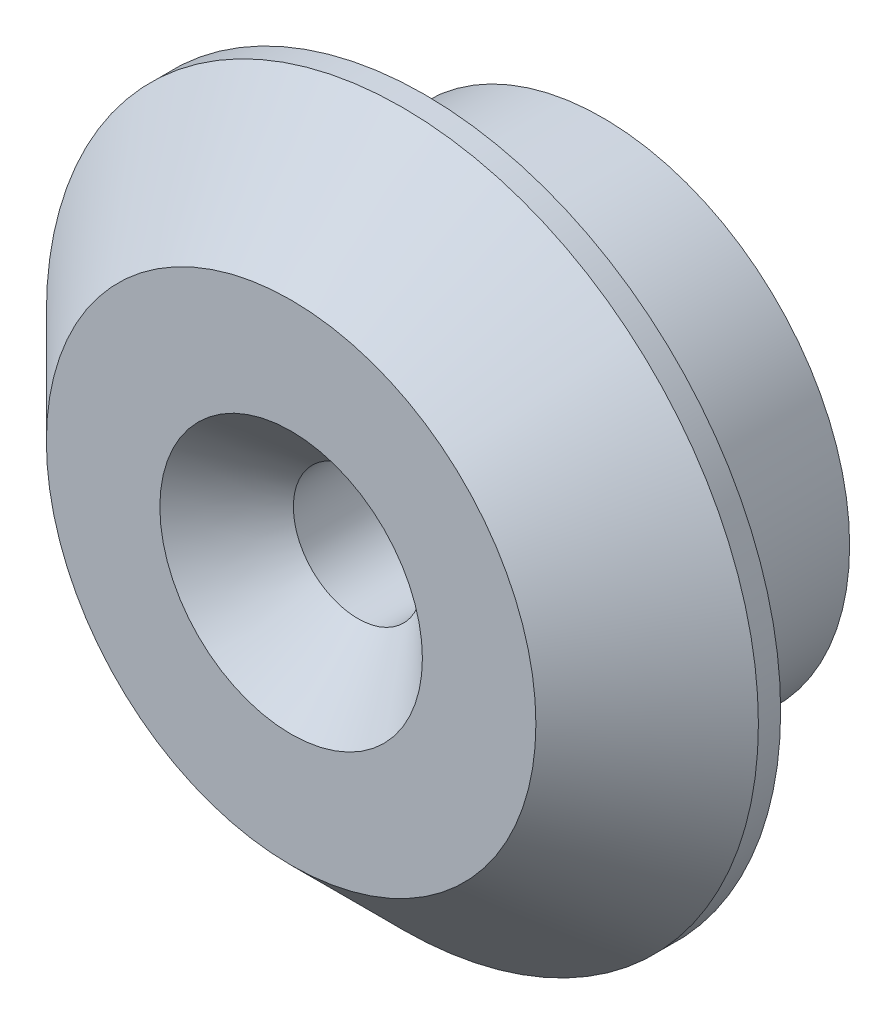
ISO-10303-21;
HEADER;
FILE_DESCRIPTION(('STEP AP214'),'2;1');
FILE_NAME('part.step','',(''),(''),'','','');
FILE_SCHEMA(('AUTOMOTIVE_DESIGN { 1 0 10303 214 1 1 1 1 }'));
ENDSEC;
DATA;
#1=APPLICATION_CONTEXT('core data for automotive mechanical design processes');
#2=APPLICATION_PROTOCOL_DEFINITION('international standard','automotive_design',2000,#1);
#3=PRODUCT_CONTEXT('',#1,'mechanical');
#4=PRODUCT('Part','Part','',(#3));
#5=PRODUCT_RELATED_PRODUCT_CATEGORY('part','',(#4));
#6=PRODUCT_DEFINITION_FORMATION('','',#4);
#7=PRODUCT_DEFINITION_CONTEXT('part definition',#1,'design');
#8=PRODUCT_DEFINITION('design','',#6,#7);
#9=PRODUCT_DEFINITION_SHAPE('','',#8);
#10=(LENGTH_UNIT() NAMED_UNIT(*) SI_UNIT(.MILLI.,.METRE.));
#11=(NAMED_UNIT(*) PLANE_ANGLE_UNIT() SI_UNIT($,.RADIAN.));
#12=(NAMED_UNIT(*) SI_UNIT($,.STERADIAN.) SOLID_ANGLE_UNIT());
#13=UNCERTAINTY_MEASURE_WITH_UNIT(LENGTH_MEASURE(1.E-05),#10,'distance_accuracy_value','');
#14=(GEOMETRIC_REPRESENTATION_CONTEXT(3) GLOBAL_UNCERTAINTY_ASSIGNED_CONTEXT((#13)) GLOBAL_UNIT_ASSIGNED_CONTEXT((#10,
#11,#12)) REPRESENTATION_CONTEXT('',''));
#15=CARTESIAN_POINT('',(0.,0.,0.));
#16=DIRECTION('',(0.,0.,1.));
#17=DIRECTION('',(1.,0.,0.));
#18=AXIS2_PLACEMENT_3D('',#15,#16,#17);
#19=CARTESIAN_POINT('',(0.,0.,7.));
#20=DIRECTION('',(0.,0.,-1.));
#21=DIRECTION('',(-1.,0.,0.));
#22=AXIS2_PLACEMENT_3D('',#19,#20,#21);
#23=CYLINDRICAL_SURFACE('',#22,5.55);
#24=CARTESIAN_POINT('',(0.,0.,0.));
#25=DIRECTION('',(0.,0.,1.));
#26=DIRECTION('',(1.,0.,0.));
#27=AXIS2_PLACEMENT_3D('',#24,#25,#26);
#28=CIRCLE('',#27,5.55);
#29=CARTESIAN_POINT('',(5.55,0.,0.));
#30=VERTEX_POINT('',#29);
#31=EDGE_CURVE('E63',#30,#30,#28,.T.);
#32=ORIENTED_EDGE('',*,*,#31,.T.);
#33=EDGE_LOOP('',(#32));
#34=FACE_BOUND('',#33,.T.);
#35=CARTESIAN_POINT('',(0.,0.,4.));
#36=DIRECTION('',(0.,0.,1.));
#37=DIRECTION('',(1.,0.,0.));
#38=AXIS2_PLACEMENT_3D('',#35,#36,#37);
#39=CIRCLE('',#38,5.55);
#40=CARTESIAN_POINT('',(5.55,0.,4.));
#41=VERTEX_POINT('',#40);
#42=EDGE_CURVE('E48',#41,#41,#39,.T.);
#43=ORIENTED_EDGE('',*,*,#42,.F.);
#44=EDGE_LOOP('',(#43));
#45=FACE_BOUND('',#44,.T.);
#46=ADVANCED_FACE('F34',(#34,#45),#23,.T.);
#47=CARTESIAN_POINT('',(0.,0.,7.));
#48=DIRECTION('',(0.,0.,1.));
#49=DIRECTION('',(1.,0.,0.));
#50=AXIS2_PLACEMENT_3D('',#47,#48,#49);
#51=PLANE('',#50);
#52=CARTESIAN_POINT('',(0.,0.,7.));
#53=DIRECTION('',(0.,0.,1.));
#54=DIRECTION('',(1.,0.,0.));
#55=AXIS2_PLACEMENT_3D('',#52,#53,#54);
#56=CIRCLE('',#55,5.50000000000001);
#57=CARTESIAN_POINT('',(5.50000000000001,0.,7.));
#58=VERTEX_POINT('',#57);
#59=EDGE_CURVE('E42',#58,#58,#56,.T.);
#60=ORIENTED_EDGE('',*,*,#59,.T.);
#61=EDGE_LOOP('',(#60));
#62=FACE_BOUND('',#61,.T.);
#63=CARTESIAN_POINT('',(0.,0.,7.));
#64=DIRECTION('',(0.,0.,1.));
#65=DIRECTION('',(1.,0.,0.));
#66=AXIS2_PLACEMENT_3D('',#63,#64,#65);
#67=CIRCLE('',#66,2.95);
#68=CARTESIAN_POINT('',(2.95,0.,7.));
#69=VERTEX_POINT('',#68);
#70=EDGE_CURVE('E54',#69,#69,#67,.F.);
#71=ORIENTED_EDGE('',*,*,#70,.T.);
#72=EDGE_LOOP('',(#71));
#73=FACE_BOUND('',#72,.T.);
#74=ADVANCED_FACE('F85',(#62,#73),#51,.T.);
#75=CARTESIAN_POINT('',(0.,0.,0.));
#76=DIRECTION('',(0.,0.,1.));
#77=DIRECTION('',(1.,0.,0.));
#78=AXIS2_PLACEMENT_3D('',#75,#76,#77);
#79=PLANE('',#78);
#80=ORIENTED_EDGE('',*,*,#31,.F.);
#81=EDGE_LOOP('',(#80));
#82=FACE_BOUND('',#81,.T.);
#83=CARTESIAN_POINT('',(0.,0.,0.));
#84=DIRECTION('',(0.,0.,1.));
#85=DIRECTION('',(1.,0.,0.));
#86=AXIS2_PLACEMENT_3D('',#83,#84,#85);
#87=CIRCLE('',#86,1.45);
#88=CARTESIAN_POINT('',(1.45,0.,0.));
#89=VERTEX_POINT('',#88);
#90=EDGE_CURVE('E67',#89,#89,#87,.T.);
#91=ORIENTED_EDGE('',*,*,#90,.T.);
#92=EDGE_LOOP('',(#91));
#93=FACE_BOUND('',#92,.T.);
#94=ADVANCED_FACE('F91',(#82,#93),#79,.F.);
#95=CARTESIAN_POINT('',(0.,0.,7.));
#96=DIRECTION('',(0.,0.,-1.));
#97=DIRECTION('',(-1.,0.,0.));
#98=AXIS2_PLACEMENT_3D('',#95,#96,#97);
#99=CYLINDRICAL_SURFACE('',#98,1.45);
#100=CARTESIAN_POINT('',(0.,0.,5.5));
#101=DIRECTION('',(0.,0.,1.));
#102=DIRECTION('',(1.,0.,0.));
#103=AXIS2_PLACEMENT_3D('',#100,#101,#102);
#104=CIRCLE('',#103,1.45);
#105=CARTESIAN_POINT('',(1.45,0.,5.5));
#106=VERTEX_POINT('',#105);
#107=EDGE_CURVE('E59',#106,#106,#104,.T.);
#108=ORIENTED_EDGE('',*,*,#107,.T.);
#109=EDGE_LOOP('',(#108));
#110=FACE_BOUND('',#109,.T.);
#111=ORIENTED_EDGE('',*,*,#90,.F.);
#112=EDGE_LOOP('',(#111));
#113=FACE_BOUND('',#112,.T.);
#114=ADVANCED_FACE('F95',(#110,#113),#99,.F.);
#115=CARTESIAN_POINT('',(0.,0.,5.5));
#116=DIRECTION('',(0.,0.,1.));
#117=DIRECTION('',(1.,0.,0.));
#118=AXIS2_PLACEMENT_3D('',#115,#116,#117);
#119=CONICAL_SURFACE('',#118,1.45,0.785398163397449);
#120=CARTESIAN_POINT('',(2.95,0.,7.));
#121=CARTESIAN_POINT('',(2.934375,0.,6.984375));
#122=CARTESIAN_POINT('',(2.91875,0.,6.96875));
#123=CARTESIAN_POINT('',(2.8875,0.,6.9375));
#124=CARTESIAN_POINT('',(2.871875,0.,6.921875));
#125=CARTESIAN_POINT('',(2.840625,0.,6.890625));
#126=CARTESIAN_POINT('',(2.825,0.,6.875));
#127=CARTESIAN_POINT('',(2.79375,0.,6.84375));
#128=CARTESIAN_POINT('',(2.778125,0.,6.828125));
#129=CARTESIAN_POINT('',(2.746875,0.,6.796875));
#130=CARTESIAN_POINT('',(2.73125,0.,6.78125));
#131=CARTESIAN_POINT('',(2.7,0.,6.75));
#132=CARTESIAN_POINT('',(2.684375,0.,6.734375));
#133=CARTESIAN_POINT('',(2.653125,0.,6.703125));
#134=CARTESIAN_POINT('',(2.6375,0.,6.6875));
#135=CARTESIAN_POINT('',(2.60625,0.,6.65625));
#136=CARTESIAN_POINT('',(2.590625,0.,6.640625));
#137=CARTESIAN_POINT('',(2.559375,0.,6.609375));
#138=CARTESIAN_POINT('',(2.54375,0.,6.59375));
#139=CARTESIAN_POINT('',(2.5125,0.,6.5625));
#140=CARTESIAN_POINT('',(2.496875,0.,6.546875));
#141=CARTESIAN_POINT('',(2.465625,0.,6.515625));
#142=CARTESIAN_POINT('',(2.45,0.,6.5));
#143=CARTESIAN_POINT('',(2.41875,0.,6.46875));
#144=CARTESIAN_POINT('',(2.403125,0.,6.453125));
#145=CARTESIAN_POINT('',(2.371875,0.,6.421875));
#146=CARTESIAN_POINT('',(2.35625,0.,6.40625));
#147=CARTESIAN_POINT('',(2.325,0.,6.375));
#148=CARTESIAN_POINT('',(2.309375,0.,6.359375));
#149=CARTESIAN_POINT('',(2.278125,0.,6.328125));
#150=CARTESIAN_POINT('',(2.2625,0.,6.3125));
#151=CARTESIAN_POINT('',(2.23125,0.,6.28125));
#152=CARTESIAN_POINT('',(2.215625,0.,6.265625));
#153=CARTESIAN_POINT('',(2.184375,0.,6.234375));
#154=CARTESIAN_POINT('',(2.16875,0.,6.21875));
#155=CARTESIAN_POINT('',(2.1375,0.,6.1875));
#156=CARTESIAN_POINT('',(2.121875,0.,6.171875));
#157=CARTESIAN_POINT('',(2.090625,0.,6.140625));
#158=CARTESIAN_POINT('',(2.075,0.,6.125));
#159=CARTESIAN_POINT('',(2.04375,0.,6.09375));
#160=CARTESIAN_POINT('',(2.028125,0.,6.078125));
#161=CARTESIAN_POINT('',(1.996875,0.,6.046875));
#162=CARTESIAN_POINT('',(1.98125,0.,6.03125));
#163=CARTESIAN_POINT('',(1.95,0.,6.));
#164=CARTESIAN_POINT('',(1.934375,0.,5.984375));
#165=CARTESIAN_POINT('',(1.903125,0.,5.953125));
#166=CARTESIAN_POINT('',(1.8875,0.,5.9375));
#167=CARTESIAN_POINT('',(1.85625,0.,5.90625));
#168=CARTESIAN_POINT('',(1.840625,0.,5.890625));
#169=CARTESIAN_POINT('',(1.809375,0.,5.859375));
#170=CARTESIAN_POINT('',(1.79375,0.,5.84375));
#171=CARTESIAN_POINT('',(1.7625,0.,5.8125));
#172=CARTESIAN_POINT('',(1.746875,0.,5.796875));
#173=CARTESIAN_POINT('',(1.715625,0.,5.765625));
#174=CARTESIAN_POINT('',(1.7,0.,5.75));
#175=CARTESIAN_POINT('',(1.66875,0.,5.71875));
#176=CARTESIAN_POINT('',(1.653125,0.,5.703125));
#177=CARTESIAN_POINT('',(1.621875,0.,5.671875));
#178=CARTESIAN_POINT('',(1.60625,0.,5.65625));
#179=CARTESIAN_POINT('',(1.575,0.,5.625));
#180=CARTESIAN_POINT('',(1.559375,0.,5.609375));
#181=CARTESIAN_POINT('',(1.528125,0.,5.578125));
#182=CARTESIAN_POINT('',(1.5125,0.,5.5625));
#183=CARTESIAN_POINT('',(1.48125,0.,5.53125));
#184=CARTESIAN_POINT('',(1.465625,0.,5.515625));
#185=CARTESIAN_POINT('',(1.45,0.,5.5));
#186=B_SPLINE_CURVE_WITH_KNOTS('',3,(#120,#121,#122,#123,#124,#125,#126,#127,#128,#129,#130,
#131,#132,#133,#134,#135,#136,#137,#138,#139,#140,#141,#142,#143,#144,#145,#146,#147,#148,#149,
#150,#151,#152,#153,#154,#155,#156,#157,#158,#159,#160,#161,#162,#163,#164,#165,#166,#167,#168,
#169,#170,#171,#172,#173,#174,#175,#176,#177,#178,#179,#180,#181,#182,#183,#184,#185),
.UNSPECIFIED.,.F.,.F.,(4,2,2,2,2,2,2,2,2,2,2,2,2,2,2,2,2,2,2,2,2,2,2,2,2,2,2,2,2,2,2,2,4),(0.,
0.0662912607362389,0.132582521472478,0.198873782208717,0.265165042944955,0.331456303681194,
0.397747564417433,0.464038825153672,0.53033008588991,0.59662134662615,0.662912607362388,
0.729203868098626,0.795495128834865,0.861786389571104,0.928077650307343,0.994368911043581,
1.06066017177982,1.12695143251606,1.1932426932523,1.25953395398854,1.32582521472478,
1.39211647546101,1.45840773619725,1.52469899693349,1.59099025766973,1.65728151840597,
1.72357277914221,1.78986403987845,1.85615530061468,1.92244656135092,1.98873782208716,
2.0550290828234,2.12132034355964),.UNSPECIFIED.);
#187=EDGE_CURVE('BSEAM80',#69,#106,#186,.T.);
#188=ORIENTED_EDGE('',*,*,#70,.F.);
#189=ORIENTED_EDGE('',*,*,#107,.F.);
#190=ORIENTED_EDGE('',*,*,#187,.T.);
#191=ORIENTED_EDGE('',*,*,#187,.F.);
#192=EDGE_LOOP('',(#188,#190,#189,#191));
#193=FACE_BOUND('',#192,.T.);
#194=ADVANCED_FACE('F80',(#193),#119,.F.);
#195=CARTESIAN_POINT('',(0.,0.,4.));
#196=DIRECTION('',(0.,0.,1.));
#197=DIRECTION('',(1.,0.,0.));
#198=AXIS2_PLACEMENT_3D('',#195,#196,#197);
#199=PLANE('',#198);
#200=CARTESIAN_POINT('',(0.,0.,4.));
#201=DIRECTION('',(0.,0.,1.));
#202=DIRECTION('',(1.,0.,0.));
#203=AXIS2_PLACEMENT_3D('',#200,#201,#202);
#204=CIRCLE('',#203,8.);
#205=CARTESIAN_POINT('',(8.,0.,4.));
#206=VERTEX_POINT('',#205);
#207=EDGE_CURVE('E71',#206,#206,#204,.T.);
#208=ORIENTED_EDGE('',*,*,#207,.F.);
#209=EDGE_LOOP('',(#208));
#210=FACE_BOUND('',#209,.T.);
#211=ORIENTED_EDGE('',*,*,#42,.T.);
#212=EDGE_LOOP('',(#211));
#213=FACE_BOUND('',#212,.T.);
#214=ADVANCED_FACE('F77',(#210,#213),#199,.F.);
#215=CARTESIAN_POINT('',(0.,0.,7.));
#216=DIRECTION('',(0.,0.,-1.));
#217=DIRECTION('',(-1.,0.,0.));
#218=AXIS2_PLACEMENT_3D('',#215,#216,#217);
#219=CYLINDRICAL_SURFACE('',#218,8.);
#220=CARTESIAN_POINT('',(0.,0.,4.5));
#221=DIRECTION('',(0.,0.,1.));
#222=DIRECTION('',(1.,0.,0.));
#223=AXIS2_PLACEMENT_3D('',#220,#221,#222);
#224=CIRCLE('',#223,8.);
#225=CARTESIAN_POINT('',(8.,0.,4.5));
#226=VERTEX_POINT('',#225);
#227=EDGE_CURVE('E10',#226,#226,#224,.F.);
#228=ORIENTED_EDGE('',*,*,#227,.T.);
#229=EDGE_LOOP('',(#228));
#230=FACE_BOUND('',#229,.T.);
#231=ORIENTED_EDGE('',*,*,#207,.T.);
#232=EDGE_LOOP('',(#231));
#233=FACE_BOUND('',#232,.T.);
#234=ADVANCED_FACE('F75',(#230,#233),#219,.T.);
#235=CARTESIAN_POINT('',(0.,0.,7.));
#236=DIRECTION('',(0.,0.,-1.));
#237=DIRECTION('',(-1.,0.,0.));
#238=AXIS2_PLACEMENT_3D('',#235,#236,#237);
#239=CONICAL_SURFACE('',#238,5.50000000000001,0.785398163397447);
#240=ORIENTED_EDGE('',*,*,#227,.F.);
#241=EDGE_LOOP('',(#240));
#242=FACE_BOUND('',#241,.T.);
#243=ORIENTED_EDGE('',*,*,#59,.F.);
#244=EDGE_LOOP('',(#243));
#245=FACE_BOUND('',#244,.T.);
#246=ADVANCED_FACE('F36',(#242,#245),#239,.T.);
#247=CLOSED_SHELL('',(#46,#74,#94,#114,#194,#214,#234,#246));
#248=MANIFOLD_SOLID_BREP('B2',#247);
#249=ADVANCED_BREP_SHAPE_REPRESENTATION('',(#18,#248),#14);
#250=SHAPE_DEFINITION_REPRESENTATION(#9,#249);
ENDSEC;
END-ISO-10303-21;
